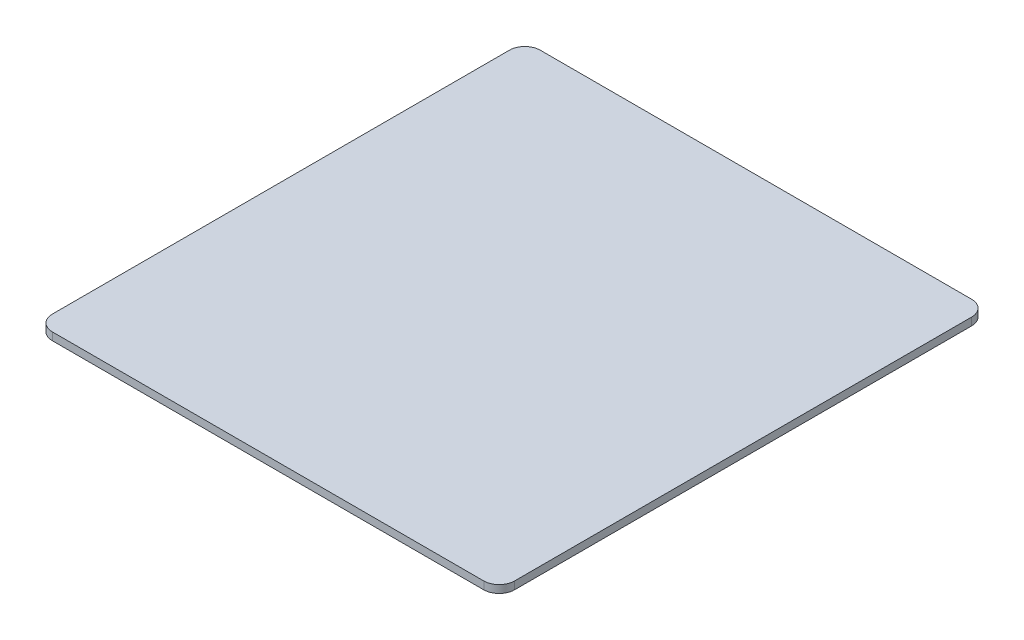
ISO-10303-21;
HEADER;
FILE_DESCRIPTION(('STEP AP214'),'2;1');
FILE_NAME('part.step','',(''),(''),'','','');
FILE_SCHEMA(('AUTOMOTIVE_DESIGN { 1 0 10303 214 1 1 1 1 }'));
ENDSEC;
DATA;
#1=APPLICATION_CONTEXT('core data for automotive mechanical design processes');
#2=APPLICATION_PROTOCOL_DEFINITION('international standard','automotive_design',2000,#1);
#3=PRODUCT_CONTEXT('',#1,'mechanical');
#4=PRODUCT('Part','Part','',(#3));
#5=PRODUCT_RELATED_PRODUCT_CATEGORY('part','',(#4));
#6=PRODUCT_DEFINITION_FORMATION('','',#4);
#7=PRODUCT_DEFINITION_CONTEXT('part definition',#1,'design');
#8=PRODUCT_DEFINITION('design','',#6,#7);
#9=PRODUCT_DEFINITION_SHAPE('','',#8);
#10=(LENGTH_UNIT() NAMED_UNIT(*) SI_UNIT(.MILLI.,.METRE.));
#11=(NAMED_UNIT(*) PLANE_ANGLE_UNIT() SI_UNIT($,.RADIAN.));
#12=(NAMED_UNIT(*) SI_UNIT($,.STERADIAN.) SOLID_ANGLE_UNIT());
#13=UNCERTAINTY_MEASURE_WITH_UNIT(LENGTH_MEASURE(1.E-05),#10,'distance_accuracy_value','');
#14=(GEOMETRIC_REPRESENTATION_CONTEXT(3) GLOBAL_UNCERTAINTY_ASSIGNED_CONTEXT((#13)) GLOBAL_UNIT_ASSIGNED_CONTEXT((#10,
#11,#12)) REPRESENTATION_CONTEXT('',''));
#15=CARTESIAN_POINT('',(0.,0.,0.));
#16=DIRECTION('',(0.,0.,1.));
#17=DIRECTION('',(1.,0.,0.));
#18=AXIS2_PLACEMENT_3D('',#15,#16,#17);
#19=CARTESIAN_POINT('',(90.,-3.,95.));
#20=DIRECTION('',(1.,0.,0.));
#21=DIRECTION('',(0.,0.,-1.));
#22=AXIS2_PLACEMENT_3D('',#19,#20,#21);
#23=PLANE('',#22);
#24=DIRECTION('',(0.,0.,-1.));
#25=VECTOR('',#24,1.);
#26=CARTESIAN_POINT('',(90.,0.,95.));
#27=LINE('',#26,#25);
#28=CARTESIAN_POINT('',(90.,0.,89.));
#29=VERTEX_POINT('',#28);
#30=CARTESIAN_POINT('',(90.,0.,-89.));
#31=VERTEX_POINT('',#30);
#32=EDGE_CURVE('E103',#29,#31,#27,.T.);
#33=ORIENTED_EDGE('',*,*,#32,.F.);
#34=DIRECTION('',(0.,1.,0.));
#35=VECTOR('',#34,1.);
#36=CARTESIAN_POINT('',(90.,-3.,89.));
#37=LINE('',#36,#35);
#38=CARTESIAN_POINT('',(90.,-3.,89.));
#39=VERTEX_POINT('',#38);
#40=EDGE_CURVE('E11',#29,#39,#37,.F.);
#41=ORIENTED_EDGE('',*,*,#40,.T.);
#42=DIRECTION('',(0.,0.,-1.));
#43=VECTOR('',#42,1.);
#44=CARTESIAN_POINT('',(90.,-3.,95.));
#45=LINE('',#44,#43);
#46=CARTESIAN_POINT('',(90.,-3.,-89.));
#47=VERTEX_POINT('',#46);
#48=EDGE_CURVE('E153',#39,#47,#45,.T.);
#49=ORIENTED_EDGE('',*,*,#48,.T.);
#50=DIRECTION('',(0.,1.,0.));
#51=VECTOR('',#50,1.);
#52=CARTESIAN_POINT('',(90.,-3.,-89.));
#53=LINE('',#52,#51);
#54=EDGE_CURVE('E40',#47,#31,#53,.T.);
#55=ORIENTED_EDGE('',*,*,#54,.T.);
#56=EDGE_LOOP('',(#33,#41,#49,#55));
#57=FACE_BOUND('',#56,.T.);
#58=ADVANCED_FACE('F32',(#57),#23,.T.);
#59=CARTESIAN_POINT('',(-90.,-3.,95.));
#60=DIRECTION('',(0.,0.,1.));
#61=DIRECTION('',(1.,0.,0.));
#62=AXIS2_PLACEMENT_3D('',#59,#60,#61);
#63=PLANE('',#62);
#64=DIRECTION('',(1.,0.,0.));
#65=VECTOR('',#64,1.);
#66=CARTESIAN_POINT('',(-90.,0.,95.));
#67=LINE('',#66,#65);
#68=CARTESIAN_POINT('',(-84.,0.,95.));
#69=VERTEX_POINT('',#68);
#70=CARTESIAN_POINT('',(84.,0.,95.));
#71=VERTEX_POINT('',#70);
#72=EDGE_CURVE('E128',#69,#71,#67,.T.);
#73=ORIENTED_EDGE('',*,*,#72,.F.);
#74=DIRECTION('',(0.,1.,0.));
#75=VECTOR('',#74,1.);
#76=CARTESIAN_POINT('',(-84.,-3.,95.));
#77=LINE('',#76,#75);
#78=CARTESIAN_POINT('',(-84.,-3.,95.));
#79=VERTEX_POINT('',#78);
#80=EDGE_CURVE('E54',#69,#79,#77,.F.);
#81=ORIENTED_EDGE('',*,*,#80,.T.);
#82=DIRECTION('',(1.,0.,0.));
#83=VECTOR('',#82,1.);
#84=CARTESIAN_POINT('',(-90.,-3.,95.));
#85=LINE('',#84,#83);
#86=CARTESIAN_POINT('',(84.,-3.,95.));
#87=VERTEX_POINT('',#86);
#88=EDGE_CURVE('E122',#79,#87,#85,.T.);
#89=ORIENTED_EDGE('',*,*,#88,.T.);
#90=DIRECTION('',(0.,1.,0.));
#91=VECTOR('',#90,1.);
#92=CARTESIAN_POINT('',(84.,-3.,95.));
#93=LINE('',#92,#91);
#94=EDGE_CURVE('E147',#87,#71,#93,.T.);
#95=ORIENTED_EDGE('',*,*,#94,.T.);
#96=EDGE_LOOP('',(#73,#81,#89,#95));
#97=FACE_BOUND('',#96,.T.);
#98=ADVANCED_FACE('F185',(#97),#63,.T.);
#99=CARTESIAN_POINT('',(-90.,-3.,95.));
#100=DIRECTION('',(-1.,0.,0.));
#101=DIRECTION('',(0.,0.,1.));
#102=AXIS2_PLACEMENT_3D('',#99,#100,#101);
#103=PLANE('',#102);
#104=DIRECTION('',(0.,0.,1.));
#105=VECTOR('',#104,1.);
#106=CARTESIAN_POINT('',(-90.,0.,95.));
#107=LINE('',#106,#105);
#108=CARTESIAN_POINT('',(-90.,0.,-89.));
#109=VERTEX_POINT('',#108);
#110=CARTESIAN_POINT('',(-90.,0.,89.));
#111=VERTEX_POINT('',#110);
#112=EDGE_CURVE('E118',#109,#111,#107,.T.);
#113=ORIENTED_EDGE('',*,*,#112,.F.);
#114=DIRECTION('',(0.,1.,0.));
#115=VECTOR('',#114,1.);
#116=CARTESIAN_POINT('',(-90.,-3.,-89.));
#117=LINE('',#116,#115);
#118=CARTESIAN_POINT('',(-90.,-3.,-89.));
#119=VERTEX_POINT('',#118);
#120=EDGE_CURVE('E139',#109,#119,#117,.F.);
#121=ORIENTED_EDGE('',*,*,#120,.T.);
#122=DIRECTION('',(0.,0.,1.));
#123=VECTOR('',#122,1.);
#124=CARTESIAN_POINT('',(-90.,-3.,95.));
#125=LINE('',#124,#123);
#126=CARTESIAN_POINT('',(-90.,-3.,89.));
#127=VERTEX_POINT('',#126);
#128=EDGE_CURVE('E125',#119,#127,#125,.T.);
#129=ORIENTED_EDGE('',*,*,#128,.T.);
#130=DIRECTION('',(0.,1.,0.));
#131=VECTOR('',#130,1.);
#132=CARTESIAN_POINT('',(-90.,-3.,89.));
#133=LINE('',#132,#131);
#134=EDGE_CURVE('E136',#127,#111,#133,.T.);
#135=ORIENTED_EDGE('',*,*,#134,.T.);
#136=EDGE_LOOP('',(#113,#121,#129,#135));
#137=FACE_BOUND('',#136,.T.);
#138=ADVANCED_FACE('F165',(#137),#103,.T.);
#139=CARTESIAN_POINT('',(-90.,-3.,-95.));
#140=DIRECTION('',(0.,0.,-1.));
#141=DIRECTION('',(-1.,0.,0.));
#142=AXIS2_PLACEMENT_3D('',#139,#140,#141);
#143=PLANE('',#142);
#144=DIRECTION('',(-1.,0.,0.));
#145=VECTOR('',#144,1.);
#146=CARTESIAN_POINT('',(-90.,-3.,-95.));
#147=LINE('',#146,#145);
#148=CARTESIAN_POINT('',(84.,-3.,-95.));
#149=VERTEX_POINT('',#148);
#150=CARTESIAN_POINT('',(-84.,-3.,-95.));
#151=VERTEX_POINT('',#150);
#152=EDGE_CURVE('E154',#149,#151,#147,.T.);
#153=ORIENTED_EDGE('',*,*,#152,.T.);
#154=DIRECTION('',(0.,1.,0.));
#155=VECTOR('',#154,1.);
#156=CARTESIAN_POINT('',(-84.,-3.,-95.));
#157=LINE('',#156,#155);
#158=CARTESIAN_POINT('',(-84.,0.,-95.));
#159=VERTEX_POINT('',#158);
#160=EDGE_CURVE('E109',#151,#159,#157,.T.);
#161=ORIENTED_EDGE('',*,*,#160,.T.);
#162=DIRECTION('',(-1.,0.,0.));
#163=VECTOR('',#162,1.);
#164=CARTESIAN_POINT('',(-90.,0.,-95.));
#165=LINE('',#164,#163);
#166=CARTESIAN_POINT('',(84.,0.,-95.));
#167=VERTEX_POINT('',#166);
#168=EDGE_CURVE('E101',#167,#159,#165,.T.);
#169=ORIENTED_EDGE('',*,*,#168,.F.);
#170=DIRECTION('',(0.,1.,0.));
#171=VECTOR('',#170,1.);
#172=CARTESIAN_POINT('',(84.,-3.,-95.));
#173=LINE('',#172,#171);
#174=EDGE_CURVE('E115',#167,#149,#173,.F.);
#175=ORIENTED_EDGE('',*,*,#174,.T.);
#176=EDGE_LOOP('',(#153,#161,#169,#175));
#177=FACE_BOUND('',#176,.T.);
#178=ADVANCED_FACE('F114',(#177),#143,.T.);
#179=CARTESIAN_POINT('',(0.,-3.,0.));
#180=DIRECTION('',(0.,-1.,0.));
#181=DIRECTION('',(0.,0.,-1.));
#182=AXIS2_PLACEMENT_3D('',#179,#180,#181);
#183=PLANE('',#182);
#184=ORIENTED_EDGE('',*,*,#128,.F.);
#185=CARTESIAN_POINT('',(-84.,-3.,-89.));
#186=DIRECTION('',(0.,-1.,0.));
#187=DIRECTION('',(0.,0.,-1.));
#188=AXIS2_PLACEMENT_3D('',#185,#186,#187);
#189=CIRCLE('',#188,6.);
#190=EDGE_CURVE('E145',#119,#151,#189,.T.);
#191=ORIENTED_EDGE('',*,*,#190,.T.);
#192=ORIENTED_EDGE('',*,*,#152,.F.);
#193=CARTESIAN_POINT('',(84.,-3.,-89.));
#194=DIRECTION('',(0.,-1.,0.));
#195=DIRECTION('',(0.,0.,-1.));
#196=AXIS2_PLACEMENT_3D('',#193,#194,#195);
#197=CIRCLE('',#196,6.);
#198=EDGE_CURVE('E121',#149,#47,#197,.T.);
#199=ORIENTED_EDGE('',*,*,#198,.T.);
#200=ORIENTED_EDGE('',*,*,#48,.F.);
#201=CARTESIAN_POINT('',(84.,-3.,89.));
#202=DIRECTION('',(0.,-1.,0.));
#203=DIRECTION('',(0.,0.,-1.));
#204=AXIS2_PLACEMENT_3D('',#201,#202,#203);
#205=CIRCLE('',#204,6.);
#206=EDGE_CURVE('E47',#39,#87,#205,.T.);
#207=ORIENTED_EDGE('',*,*,#206,.T.);
#208=ORIENTED_EDGE('',*,*,#88,.F.);
#209=CARTESIAN_POINT('',(-84.,-3.,89.));
#210=DIRECTION('',(0.,-1.,0.));
#211=DIRECTION('',(0.,0.,-1.));
#212=AXIS2_PLACEMENT_3D('',#209,#210,#211);
#213=CIRCLE('',#212,6.);
#214=EDGE_CURVE('E143',#79,#127,#213,.T.);
#215=ORIENTED_EDGE('',*,*,#214,.T.);
#216=EDGE_LOOP('',(#184,#191,#192,#199,#200,#207,#208,#215));
#217=FACE_BOUND('',#216,.T.);
#218=ADVANCED_FACE('F171',(#217),#183,.T.);
#219=CARTESIAN_POINT('',(0.,0.,0.));
#220=DIRECTION('',(0.,-1.,0.));
#221=DIRECTION('',(0.,0.,-1.));
#222=AXIS2_PLACEMENT_3D('',#219,#220,#221);
#223=PLANE('',#222);
#224=ORIENTED_EDGE('',*,*,#168,.T.);
#225=CARTESIAN_POINT('',(-84.,0.,-89.));
#226=DIRECTION('',(0.,-1.,0.));
#227=DIRECTION('',(0.,0.,-1.));
#228=AXIS2_PLACEMENT_3D('',#225,#226,#227);
#229=CIRCLE('',#228,6.);
#230=EDGE_CURVE('E134',#159,#109,#229,.F.);
#231=ORIENTED_EDGE('',*,*,#230,.T.);
#232=ORIENTED_EDGE('',*,*,#112,.T.);
#233=CARTESIAN_POINT('',(-84.,0.,89.));
#234=DIRECTION('',(0.,-1.,0.));
#235=DIRECTION('',(0.,0.,-1.));
#236=AXIS2_PLACEMENT_3D('',#233,#234,#235);
#237=CIRCLE('',#236,6.);
#238=EDGE_CURVE('E132',#111,#69,#237,.F.);
#239=ORIENTED_EDGE('',*,*,#238,.T.);
#240=ORIENTED_EDGE('',*,*,#72,.T.);
#241=CARTESIAN_POINT('',(84.,0.,89.));
#242=DIRECTION('',(0.,-1.,0.));
#243=DIRECTION('',(0.,0.,-1.));
#244=AXIS2_PLACEMENT_3D('',#241,#242,#243);
#245=CIRCLE('',#244,6.);
#246=EDGE_CURVE('E108',#71,#29,#245,.F.);
#247=ORIENTED_EDGE('',*,*,#246,.T.);
#248=ORIENTED_EDGE('',*,*,#32,.T.);
#249=CARTESIAN_POINT('',(84.,0.,-89.));
#250=DIRECTION('',(0.,-1.,0.));
#251=DIRECTION('',(0.,0.,-1.));
#252=AXIS2_PLACEMENT_3D('',#249,#250,#251);
#253=CIRCLE('',#252,6.);
#254=EDGE_CURVE('E98',#31,#167,#253,.F.);
#255=ORIENTED_EDGE('',*,*,#254,.T.);
#256=EDGE_LOOP('',(#224,#231,#232,#239,#240,#247,#248,#255));
#257=FACE_BOUND('',#256,.T.);
#258=ADVANCED_FACE('F100',(#257),#223,.F.);
#259=CARTESIAN_POINT('',(-84.,-3.,-89.));
#260=DIRECTION('',(0.,1.,0.));
#261=DIRECTION('',(0.,0.,1.));
#262=AXIS2_PLACEMENT_3D('',#259,#260,#261);
#263=CYLINDRICAL_SURFACE('',#262,6.);
#264=ORIENTED_EDGE('',*,*,#190,.F.);
#265=ORIENTED_EDGE('',*,*,#120,.F.);
#266=ORIENTED_EDGE('',*,*,#230,.F.);
#267=ORIENTED_EDGE('',*,*,#160,.F.);
#268=EDGE_LOOP('',(#264,#265,#266,#267));
#269=FACE_BOUND('',#268,.T.);
#270=ADVANCED_FACE('F170',(#269),#263,.T.);
#271=CARTESIAN_POINT('',(-84.,-3.,89.));
#272=DIRECTION('',(0.,1.,0.));
#273=DIRECTION('',(0.,0.,1.));
#274=AXIS2_PLACEMENT_3D('',#271,#272,#273);
#275=CYLINDRICAL_SURFACE('',#274,6.);
#276=ORIENTED_EDGE('',*,*,#214,.F.);
#277=ORIENTED_EDGE('',*,*,#80,.F.);
#278=ORIENTED_EDGE('',*,*,#238,.F.);
#279=ORIENTED_EDGE('',*,*,#134,.F.);
#280=EDGE_LOOP('',(#276,#277,#278,#279));
#281=FACE_BOUND('',#280,.T.);
#282=ADVANCED_FACE('F174',(#281),#275,.T.);
#283=CARTESIAN_POINT('',(84.,-3.,89.));
#284=DIRECTION('',(0.,1.,0.));
#285=DIRECTION('',(0.,0.,1.));
#286=AXIS2_PLACEMENT_3D('',#283,#284,#285);
#287=CYLINDRICAL_SURFACE('',#286,6.);
#288=ORIENTED_EDGE('',*,*,#206,.F.);
#289=ORIENTED_EDGE('',*,*,#40,.F.);
#290=ORIENTED_EDGE('',*,*,#246,.F.);
#291=ORIENTED_EDGE('',*,*,#94,.F.);
#292=EDGE_LOOP('',(#288,#289,#290,#291));
#293=FACE_BOUND('',#292,.T.);
#294=ADVANCED_FACE('F176',(#293),#287,.T.);
#295=CARTESIAN_POINT('',(84.,-3.,-89.));
#296=DIRECTION('',(0.,1.,0.));
#297=DIRECTION('',(0.,0.,1.));
#298=AXIS2_PLACEMENT_3D('',#295,#296,#297);
#299=CYLINDRICAL_SURFACE('',#298,6.);
#300=ORIENTED_EDGE('',*,*,#198,.F.);
#301=ORIENTED_EDGE('',*,*,#174,.F.);
#302=ORIENTED_EDGE('',*,*,#254,.F.);
#303=ORIENTED_EDGE('',*,*,#54,.F.);
#304=EDGE_LOOP('',(#300,#301,#302,#303));
#305=FACE_BOUND('',#304,.T.);
#306=ADVANCED_FACE('F34',(#305),#299,.T.);
#307=CLOSED_SHELL('',(#58,#98,#138,#178,#218,#258,#270,#282,#294,#306));
#308=MANIFOLD_SOLID_BREP('B2',#307);
#309=ADVANCED_BREP_SHAPE_REPRESENTATION('',(#18,#308),#14);
#310=SHAPE_DEFINITION_REPRESENTATION(#9,#309);
ENDSEC;
END-ISO-10303-21;
